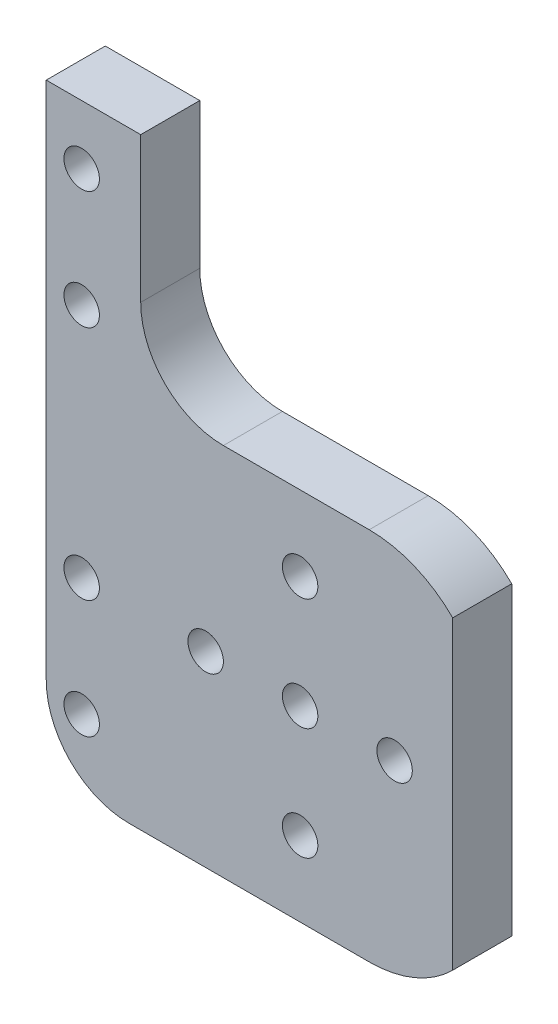
ISO-10303-21;
HEADER;
FILE_DESCRIPTION(('STEP AP214'),'2;1');
FILE_NAME('part.step','',(''),(''),'','','');
FILE_SCHEMA(('AUTOMOTIVE_DESIGN { 1 0 10303 214 1 1 1 1 }'));
ENDSEC;
DATA;
#1=APPLICATION_CONTEXT('core data for automotive mechanical design processes');
#2=APPLICATION_PROTOCOL_DEFINITION('international standard','automotive_design',2000,#1);
#3=PRODUCT_CONTEXT('',#1,'mechanical');
#4=PRODUCT('Part','Part','',(#3));
#5=PRODUCT_RELATED_PRODUCT_CATEGORY('part','',(#4));
#6=PRODUCT_DEFINITION_FORMATION('','',#4);
#7=PRODUCT_DEFINITION_CONTEXT('part definition',#1,'design');
#8=PRODUCT_DEFINITION('design','',#6,#7);
#9=PRODUCT_DEFINITION_SHAPE('','',#8);
#10=(LENGTH_UNIT() NAMED_UNIT(*) SI_UNIT(.MILLI.,.METRE.));
#11=(NAMED_UNIT(*) PLANE_ANGLE_UNIT() SI_UNIT($,.RADIAN.));
#12=(NAMED_UNIT(*) SI_UNIT($,.STERADIAN.) SOLID_ANGLE_UNIT());
#13=UNCERTAINTY_MEASURE_WITH_UNIT(LENGTH_MEASURE(1.E-05),#10,'distance_accuracy_value','');
#14=(GEOMETRIC_REPRESENTATION_CONTEXT(3) GLOBAL_UNCERTAINTY_ASSIGNED_CONTEXT((#13)) GLOBAL_UNIT_ASSIGNED_CONTEXT((#10,
#11,#12)) REPRESENTATION_CONTEXT('',''));
#15=CARTESIAN_POINT('',(0.,0.,0.));
#16=DIRECTION('',(0.,0.,1.));
#17=DIRECTION('',(1.,0.,0.));
#18=AXIS2_PLACEMENT_3D('',#15,#16,#17);
#19=CARTESIAN_POINT('',(-21.790532902454,-3.77314356435643,5.));
#20=DIRECTION('',(0.,0.,-1.));
#21=DIRECTION('',(-1.,0.,0.));
#22=AXIS2_PLACEMENT_3D('',#19,#20,#21);
#23=CYLINDRICAL_SURFACE('',#22,7.);
#24=CARTESIAN_POINT('',(-21.790532902454,-3.77314356435643,0.));
#25=DIRECTION('',(0.,0.,1.));
#26=DIRECTION('',(1.,0.,0.));
#27=AXIS2_PLACEMENT_3D('',#24,#25,#26);
#28=CIRCLE('',#27,7.);
#29=CARTESIAN_POINT('',(-21.790532902454,-10.7731435643564,0.));
#30=VERTEX_POINT('',#29);
#31=CARTESIAN_POINT('',(-28.790532902454,-3.77314356435636,0.));
#32=VERTEX_POINT('',#31);
#33=EDGE_CURVE('E190',#30,#32,#28,.F.);
#34=ORIENTED_EDGE('',*,*,#33,.F.);
#35=DIRECTION('',(0.,0.,-1.));
#36=VECTOR('',#35,1.);
#37=CARTESIAN_POINT('',(-21.790532902454,-10.7731435643564,5.));
#38=LINE('',#37,#36);
#39=CARTESIAN_POINT('',(-21.790532902454,-10.7731435643564,5.));
#40=VERTEX_POINT('',#39);
#41=EDGE_CURVE('E11',#40,#30,#38,.T.);
#42=ORIENTED_EDGE('',*,*,#41,.F.);
#43=CARTESIAN_POINT('',(-21.790532902454,-3.77314356435643,5.));
#44=DIRECTION('',(0.,0.,1.));
#45=DIRECTION('',(1.,0.,0.));
#46=AXIS2_PLACEMENT_3D('',#43,#44,#45);
#47=CIRCLE('',#46,7.);
#48=CARTESIAN_POINT('',(-28.790532902454,-3.77314356435636,5.));
#49=VERTEX_POINT('',#48);
#50=EDGE_CURVE('E512',#40,#49,#47,.F.);
#51=ORIENTED_EDGE('',*,*,#50,.T.);
#52=DIRECTION('',(0.,0.,-1.));
#53=VECTOR('',#52,1.);
#54=CARTESIAN_POINT('',(-28.790532902454,-3.77314356435636,5.));
#55=LINE('',#54,#53);
#56=EDGE_CURVE('E59',#49,#32,#55,.T.);
#57=ORIENTED_EDGE('',*,*,#56,.T.);
#58=EDGE_LOOP('',(#34,#42,#51,#57));
#59=FACE_BOUND('',#58,.T.);
#60=ADVANCED_FACE('F41',(#59),#23,.T.);
#61=CARTESIAN_POINT('',(0.,-10.7731435643564,5.));
#62=DIRECTION('',(0.,1.,0.));
#63=DIRECTION('',(0.,0.,1.));
#64=AXIS2_PLACEMENT_3D('',#61,#62,#63);
#65=PLANE('',#64);
#66=DIRECTION('',(1.,0.,0.));
#67=VECTOR('',#66,1.);
#68=CARTESIAN_POINT('',(0.,-10.7731435643564,0.));
#69=LINE('',#68,#67);
#70=CARTESIAN_POINT('',(-1.44053290245401,-10.7731435643564,0.));
#71=VERTEX_POINT('',#70);
#72=EDGE_CURVE('E193',#30,#71,#69,.T.);
#73=ORIENTED_EDGE('',*,*,#72,.T.);
#74=DIRECTION('',(0.,0.,-1.));
#75=VECTOR('',#74,1.);
#76=CARTESIAN_POINT('',(-1.44053290245401,-10.7731435643564,5.));
#77=LINE('',#76,#75);
#78=CARTESIAN_POINT('',(-1.44053290245401,-10.7731435643564,5.));
#79=VERTEX_POINT('',#78);
#80=EDGE_CURVE('E51',#79,#71,#77,.T.);
#81=ORIENTED_EDGE('',*,*,#80,.F.);
#82=DIRECTION('',(1.,0.,0.));
#83=VECTOR('',#82,1.);
#84=CARTESIAN_POINT('',(0.,-10.7731435643564,5.));
#85=LINE('',#84,#83);
#86=EDGE_CURVE('E503',#40,#79,#85,.T.);
#87=ORIENTED_EDGE('',*,*,#86,.F.);
#88=ORIENTED_EDGE('',*,*,#41,.T.);
#89=EDGE_LOOP('',(#73,#81,#87,#88));
#90=FACE_BOUND('',#89,.T.);
#91=ADVANCED_FACE('F262',(#90),#65,.F.);
#92=CARTESIAN_POINT('',(-1.44053290245394,-0.77314356435643,5.));
#93=DIRECTION('',(0.,0.,-1.));
#94=DIRECTION('',(-1.,0.,0.));
#95=AXIS2_PLACEMENT_3D('',#92,#93,#94);
#96=CYLINDRICAL_SURFACE('',#95,10.);
#97=CARTESIAN_POINT('',(-1.44053290245394,-0.77314356435643,0.));
#98=DIRECTION('',(0.,0.,1.));
#99=DIRECTION('',(1.,0.,0.));
#100=AXIS2_PLACEMENT_3D('',#97,#98,#99);
#101=CIRCLE('',#100,10.);
#102=CARTESIAN_POINT('',(5.63053490941151,-7.84421137622193,0.));
#103=VERTEX_POINT('',#102);
#104=EDGE_CURVE('E197',#71,#103,#101,.T.);
#105=ORIENTED_EDGE('',*,*,#104,.T.);
#106=DIRECTION('',(0.,0.,-1.));
#107=VECTOR('',#106,1.);
#108=CARTESIAN_POINT('',(5.63053490941151,-7.84421137622193,5.));
#109=LINE('',#108,#107);
#110=CARTESIAN_POINT('',(5.63053490941151,-7.84421137622193,5.));
#111=VERTEX_POINT('',#110);
#112=EDGE_CURVE('E250',#111,#103,#109,.T.);
#113=ORIENTED_EDGE('',*,*,#112,.F.);
#114=CARTESIAN_POINT('',(-1.44053290245394,-0.77314356435643,5.));
#115=DIRECTION('',(0.,0.,1.));
#116=DIRECTION('',(1.,0.,0.));
#117=AXIS2_PLACEMENT_3D('',#114,#115,#116);
#118=CIRCLE('',#117,10.);
#119=EDGE_CURVE('E258',#79,#111,#118,.T.);
#120=ORIENTED_EDGE('',*,*,#119,.F.);
#121=ORIENTED_EDGE('',*,*,#80,.T.);
#122=EDGE_LOOP('',(#105,#113,#120,#121));
#123=FACE_BOUND('',#122,.T.);
#124=ADVANCED_FACE('F256',(#123),#96,.T.);
#125=CARTESIAN_POINT('',(5.63053490941159,0.,5.));
#126=DIRECTION('',(1.,0.,0.));
#127=DIRECTION('',(0.,1.,0.));
#128=AXIS2_PLACEMENT_3D('',#125,#126,#127);
#129=PLANE('',#128);
#130=DIRECTION('',(0.,-1.,0.));
#131=VECTOR('',#130,1.);
#132=CARTESIAN_POINT('',(5.63053490941159,0.,0.));
#133=LINE('',#132,#131);
#134=CARTESIAN_POINT('',(5.63053490941176,17.997924247512,0.));
#135=VERTEX_POINT('',#134);
#136=EDGE_CURVE('E201',#135,#103,#133,.T.);
#137=ORIENTED_EDGE('',*,*,#136,.F.);
#138=DIRECTION('',(0.,0.,-1.));
#139=VECTOR('',#138,1.);
#140=CARTESIAN_POINT('',(5.63053490941176,17.997924247512,5.));
#141=LINE('',#140,#139);
#142=CARTESIAN_POINT('',(5.63053490941176,17.997924247512,5.));
#143=VERTEX_POINT('',#142);
#144=EDGE_CURVE('E247',#143,#135,#141,.T.);
#145=ORIENTED_EDGE('',*,*,#144,.F.);
#146=DIRECTION('',(0.,-1.,0.));
#147=VECTOR('',#146,1.);
#148=CARTESIAN_POINT('',(5.63053490941159,0.,5.));
#149=LINE('',#148,#147);
#150=EDGE_CURVE('E498',#143,#111,#149,.T.);
#151=ORIENTED_EDGE('',*,*,#150,.T.);
#152=ORIENTED_EDGE('',*,*,#112,.T.);
#153=EDGE_LOOP('',(#137,#145,#151,#152));
#154=FACE_BOUND('',#153,.T.);
#155=ADVANCED_FACE('F356',(#154),#129,.T.);
#156=CARTESIAN_POINT('',(-1.44053290245393,10.9268564356468,5.));
#157=DIRECTION('',(0.,0.,-1.));
#158=DIRECTION('',(-1.,0.,0.));
#159=AXIS2_PLACEMENT_3D('',#156,#157,#158);
#160=CYLINDRICAL_SURFACE('',#159,10.);
#161=CARTESIAN_POINT('',(-1.44053290245393,10.9268564356468,0.));
#162=DIRECTION('',(0.,0.,1.));
#163=DIRECTION('',(1.,0.,0.));
#164=AXIS2_PLACEMENT_3D('',#161,#162,#163);
#165=CIRCLE('',#164,10.);
#166=CARTESIAN_POINT('',(-1.44053290245393,20.9268564356468,0.));
#167=VERTEX_POINT('',#166);
#168=EDGE_CURVE('E205',#135,#167,#165,.T.);
#169=ORIENTED_EDGE('',*,*,#168,.T.);
#170=DIRECTION('',(0.,0.,-1.));
#171=VECTOR('',#170,1.);
#172=CARTESIAN_POINT('',(-1.44053290245393,20.9268564356468,5.));
#173=LINE('',#172,#171);
#174=CARTESIAN_POINT('',(-1.44053290245393,20.9268564356468,5.));
#175=VERTEX_POINT('',#174);
#176=EDGE_CURVE('E244',#175,#167,#173,.T.);
#177=ORIENTED_EDGE('',*,*,#176,.F.);
#178=CARTESIAN_POINT('',(-1.44053290245393,10.9268564356468,5.));
#179=DIRECTION('',(0.,0.,1.));
#180=DIRECTION('',(1.,0.,0.));
#181=AXIS2_PLACEMENT_3D('',#178,#179,#180);
#182=CIRCLE('',#181,10.);
#183=EDGE_CURVE('E494',#143,#175,#182,.T.);
#184=ORIENTED_EDGE('',*,*,#183,.F.);
#185=ORIENTED_EDGE('',*,*,#144,.T.);
#186=EDGE_LOOP('',(#169,#177,#184,#185));
#187=FACE_BOUND('',#186,.T.);
#188=ADVANCED_FACE('F352',(#187),#160,.T.);
#189=CARTESIAN_POINT('',(2.41035574838785E-13,20.9268564356467,5.));
#190=DIRECTION('',(0.,1.,0.));
#191=DIRECTION('',(-1.,0.,0.));
#192=AXIS2_PLACEMENT_3D('',#189,#190,#191);
#193=PLANE('',#192);
#194=DIRECTION('',(1.,0.,0.));
#195=VECTOR('',#194,1.);
#196=CARTESIAN_POINT('',(2.41035574838785E-13,20.9268564356467,0.));
#197=LINE('',#196,#195);
#198=CARTESIAN_POINT('',(-13.7905329024566,20.9268564356469,0.));
#199=VERTEX_POINT('',#198);
#200=EDGE_CURVE('E209',#199,#167,#197,.T.);
#201=ORIENTED_EDGE('',*,*,#200,.F.);
#202=DIRECTION('',(0.,0.,-1.));
#203=VECTOR('',#202,1.);
#204=CARTESIAN_POINT('',(-13.7905329024566,20.9268564356469,5.));
#205=LINE('',#204,#203);
#206=CARTESIAN_POINT('',(-13.7905329024566,20.9268564356469,5.));
#207=VERTEX_POINT('',#206);
#208=EDGE_CURVE('E241',#207,#199,#205,.T.);
#209=ORIENTED_EDGE('',*,*,#208,.F.);
#210=DIRECTION('',(1.,0.,0.));
#211=VECTOR('',#210,1.);
#212=CARTESIAN_POINT('',(2.41035574838785E-13,20.9268564356467,5.));
#213=LINE('',#212,#211);
#214=EDGE_CURVE('E497',#207,#175,#213,.T.);
#215=ORIENTED_EDGE('',*,*,#214,.T.);
#216=ORIENTED_EDGE('',*,*,#176,.T.);
#217=EDGE_LOOP('',(#201,#209,#215,#216));
#218=FACE_BOUND('',#217,.T.);
#219=ADVANCED_FACE('F348',(#218),#193,.T.);
#220=CARTESIAN_POINT('',(-13.7905329024566,27.9268564356469,5.));
#221=DIRECTION('',(0.,0.,-1.));
#222=DIRECTION('',(-1.,0.,0.));
#223=AXIS2_PLACEMENT_3D('',#220,#221,#222);
#224=CYLINDRICAL_SURFACE('',#223,7.00000000000001);
#225=CARTESIAN_POINT('',(-13.7905329024566,27.9268564356469,0.));
#226=DIRECTION('',(0.,0.,1.));
#227=DIRECTION('',(1.,0.,0.));
#228=AXIS2_PLACEMENT_3D('',#225,#226,#227);
#229=CIRCLE('',#228,7.00000000000001);
#230=CARTESIAN_POINT('',(-20.7905329024567,27.9268564356469,0.));
#231=VERTEX_POINT('',#230);
#232=EDGE_CURVE('E213',#231,#199,#229,.T.);
#233=ORIENTED_EDGE('',*,*,#232,.F.);
#234=DIRECTION('',(0.,0.,-1.));
#235=VECTOR('',#234,1.);
#236=CARTESIAN_POINT('',(-20.7905329024567,27.9268564356469,5.));
#237=LINE('',#236,#235);
#238=CARTESIAN_POINT('',(-20.7905329024567,27.9268564356469,5.));
#239=VERTEX_POINT('',#238);
#240=EDGE_CURVE('E144',#239,#231,#237,.T.);
#241=ORIENTED_EDGE('',*,*,#240,.F.);
#242=CARTESIAN_POINT('',(-13.7905329024566,27.9268564356469,5.));
#243=DIRECTION('',(0.,0.,1.));
#244=DIRECTION('',(1.,0.,0.));
#245=AXIS2_PLACEMENT_3D('',#242,#243,#244);
#246=CIRCLE('',#245,7.00000000000001);
#247=EDGE_CURVE('E132',#239,#207,#246,.T.);
#248=ORIENTED_EDGE('',*,*,#247,.T.);
#249=ORIENTED_EDGE('',*,*,#208,.T.);
#250=EDGE_LOOP('',(#233,#241,#248,#249));
#251=FACE_BOUND('',#250,.T.);
#252=ADVANCED_FACE('F345',(#251),#224,.F.);
#253=CARTESIAN_POINT('',(-20.7905329024567,0.,5.));
#254=DIRECTION('',(-1.,0.,0.));
#255=DIRECTION('',(0.,0.,1.));
#256=AXIS2_PLACEMENT_3D('',#253,#254,#255);
#257=PLANE('',#256);
#258=DIRECTION('',(0.,1.,0.));
#259=VECTOR('',#258,1.);
#260=CARTESIAN_POINT('',(-20.7905329024567,0.,0.));
#261=LINE('',#260,#259);
#262=CARTESIAN_POINT('',(-20.7905329024567,40.2268564356436,0.));
#263=VERTEX_POINT('',#262);
#264=EDGE_CURVE('E140',#231,#263,#261,.T.);
#265=ORIENTED_EDGE('',*,*,#264,.T.);
#266=DIRECTION('',(0.,0.,-1.));
#267=VECTOR('',#266,1.);
#268=CARTESIAN_POINT('',(-20.7905329024567,40.2268564356436,5.));
#269=LINE('',#268,#267);
#270=CARTESIAN_POINT('',(-20.7905329024567,40.2268564356436,5.));
#271=VERTEX_POINT('',#270);
#272=EDGE_CURVE('E137',#271,#263,#269,.T.);
#273=ORIENTED_EDGE('',*,*,#272,.F.);
#274=DIRECTION('',(0.,1.,0.));
#275=VECTOR('',#274,1.);
#276=CARTESIAN_POINT('',(-20.7905329024567,0.,5.));
#277=LINE('',#276,#275);
#278=EDGE_CURVE('E122',#239,#271,#277,.T.);
#279=ORIENTED_EDGE('',*,*,#278,.F.);
#280=ORIENTED_EDGE('',*,*,#240,.T.);
#281=EDGE_LOOP('',(#265,#273,#279,#280));
#282=FACE_BOUND('',#281,.T.);
#283=ADVANCED_FACE('F138',(#282),#257,.F.);
#284=CARTESIAN_POINT('',(0.,40.2268564356436,5.));
#285=DIRECTION('',(0.,1.,0.));
#286=DIRECTION('',(0.,0.,1.));
#287=AXIS2_PLACEMENT_3D('',#284,#285,#286);
#288=PLANE('',#287);
#289=DIRECTION('',(1.,0.,0.));
#290=VECTOR('',#289,1.);
#291=CARTESIAN_POINT('',(0.,40.2268564356436,0.));
#292=LINE('',#291,#290);
#293=CARTESIAN_POINT('',(-28.790532902454,40.2268564356436,0.));
#294=VERTEX_POINT('',#293);
#295=EDGE_CURVE('E219',#294,#263,#292,.T.);
#296=ORIENTED_EDGE('',*,*,#295,.F.);
#297=DIRECTION('',(0.,0.,-1.));
#298=VECTOR('',#297,1.);
#299=CARTESIAN_POINT('',(-28.790532902454,40.2268564356436,5.));
#300=LINE('',#299,#298);
#301=CARTESIAN_POINT('',(-28.790532902454,40.2268564356436,5.));
#302=VERTEX_POINT('',#301);
#303=EDGE_CURVE('E90',#302,#294,#300,.T.);
#304=ORIENTED_EDGE('',*,*,#303,.F.);
#305=DIRECTION('',(1.,0.,0.));
#306=VECTOR('',#305,1.);
#307=CARTESIAN_POINT('',(0.,40.2268564356436,5.));
#308=LINE('',#307,#306);
#309=EDGE_CURVE('E129',#302,#271,#308,.T.);
#310=ORIENTED_EDGE('',*,*,#309,.T.);
#311=ORIENTED_EDGE('',*,*,#272,.T.);
#312=EDGE_LOOP('',(#296,#304,#310,#311));
#313=FACE_BOUND('',#312,.T.);
#314=ADVANCED_FACE('F146',(#313),#288,.T.);
#315=CARTESIAN_POINT('',(-25.7905329024542,25.2268564356436,5.));
#316=DIRECTION('',(0.,0.,-1.));
#317=DIRECTION('',(-1.,0.,0.));
#318=AXIS2_PLACEMENT_3D('',#315,#316,#317);
#319=CYLINDRICAL_SURFACE('',#318,1.5);
#320=CARTESIAN_POINT('',(-25.7905329024542,25.2268564356436,5.));
#321=DIRECTION('',(0.,0.,1.));
#322=DIRECTION('',(1.,0.,0.));
#323=AXIS2_PLACEMENT_3D('',#320,#321,#322);
#324=CIRCLE('',#323,1.5);
#325=CARTESIAN_POINT('',(-24.2905329024542,25.2268564356436,5.));
#326=VERTEX_POINT('',#325);
#327=EDGE_CURVE('E151',#326,#326,#324,.T.);
#328=ORIENTED_EDGE('',*,*,#327,.T.);
#329=EDGE_LOOP('',(#328));
#330=FACE_BOUND('',#329,.T.);
#331=CARTESIAN_POINT('',(-25.7905329024542,25.2268564356436,0.));
#332=DIRECTION('',(0.,0.,1.));
#333=DIRECTION('',(1.,0.,0.));
#334=AXIS2_PLACEMENT_3D('',#331,#332,#333);
#335=CIRCLE('',#334,1.5);
#336=CARTESIAN_POINT('',(-24.2905329024542,25.2268564356436,0.));
#337=VERTEX_POINT('',#336);
#338=EDGE_CURVE('E226',#337,#337,#335,.T.);
#339=ORIENTED_EDGE('',*,*,#338,.F.);
#340=EDGE_LOOP('',(#339));
#341=FACE_BOUND('',#340,.T.);
#342=ADVANCED_FACE('F335',(#330,#341),#319,.F.);
#343=CARTESIAN_POINT('',(-28.790532902454,0.,5.));
#344=DIRECTION('',(-1.,0.,0.));
#345=DIRECTION('',(0.,-1.,0.));
#346=AXIS2_PLACEMENT_3D('',#343,#344,#345);
#347=PLANE('',#346);
#348=DIRECTION('',(0.,1.,0.));
#349=VECTOR('',#348,1.);
#350=CARTESIAN_POINT('',(-28.790532902454,0.,0.));
#351=LINE('',#350,#349);
#352=EDGE_CURVE('E222',#32,#294,#351,.T.);
#353=ORIENTED_EDGE('',*,*,#352,.F.);
#354=ORIENTED_EDGE('',*,*,#56,.F.);
#355=DIRECTION('',(0.,1.,0.));
#356=VECTOR('',#355,1.);
#357=CARTESIAN_POINT('',(-28.790532902454,0.,5.));
#358=LINE('',#357,#356);
#359=EDGE_CURVE('E148',#49,#302,#358,.T.);
#360=ORIENTED_EDGE('',*,*,#359,.T.);
#361=ORIENTED_EDGE('',*,*,#303,.T.);
#362=EDGE_LOOP('',(#353,#354,#360,#361));
#363=FACE_BOUND('',#362,.T.);
#364=ADVANCED_FACE('F278',(#363),#347,.T.);
#365=CARTESIAN_POINT('',(-7.29053290245394,14.5768564356436,5.));
#366=DIRECTION('',(0.,0.,-1.));
#367=DIRECTION('',(-1.,0.,0.));
#368=AXIS2_PLACEMENT_3D('',#365,#366,#367);
#369=CYLINDRICAL_SURFACE('',#368,1.5);
#370=CARTESIAN_POINT('',(-7.29053290245394,14.5768564356436,5.));
#371=DIRECTION('',(0.,0.,1.));
#372=DIRECTION('',(1.,0.,0.));
#373=AXIS2_PLACEMENT_3D('',#370,#371,#372);
#374=CIRCLE('',#373,1.5);
#375=CARTESIAN_POINT('',(-5.79053290245394,14.5768564356436,5.));
#376=VERTEX_POINT('',#375);
#377=EDGE_CURVE('E515',#376,#376,#374,.T.);
#378=ORIENTED_EDGE('',*,*,#377,.T.);
#379=EDGE_LOOP('',(#378));
#380=FACE_BOUND('',#379,.T.);
#381=CARTESIAN_POINT('',(-7.29053290245394,14.5768564356436,0.));
#382=DIRECTION('',(0.,0.,1.));
#383=DIRECTION('',(1.,0.,0.));
#384=AXIS2_PLACEMENT_3D('',#381,#382,#383);
#385=CIRCLE('',#384,1.5);
#386=CARTESIAN_POINT('',(-5.79053290245394,14.5768564356436,0.));
#387=VERTEX_POINT('',#386);
#388=EDGE_CURVE('E186',#387,#387,#385,.T.);
#389=ORIENTED_EDGE('',*,*,#388,.F.);
#390=EDGE_LOOP('',(#389));
#391=FACE_BOUND('',#390,.T.);
#392=ADVANCED_FACE('F274',(#380,#391),#369,.F.);
#393=CARTESIAN_POINT('',(0.709467097546067,5.07685643564355,5.));
#394=DIRECTION('',(0.,0.,-1.));
#395=DIRECTION('',(-1.,0.,0.));
#396=AXIS2_PLACEMENT_3D('',#393,#394,#395);
#397=CYLINDRICAL_SURFACE('',#396,1.5);
#398=CARTESIAN_POINT('',(0.709467097546067,5.07685643564355,5.));
#399=DIRECTION('',(0.,0.,1.));
#400=DIRECTION('',(1.,0.,0.));
#401=AXIS2_PLACEMENT_3D('',#398,#399,#400);
#402=CIRCLE('',#401,1.5);
#403=CARTESIAN_POINT('',(2.20946709754607,5.07685643564355,5.));
#404=VERTEX_POINT('',#403);
#405=EDGE_CURVE('E519',#404,#404,#402,.T.);
#406=ORIENTED_EDGE('',*,*,#405,.T.);
#407=EDGE_LOOP('',(#406));
#408=FACE_BOUND('',#407,.T.);
#409=CARTESIAN_POINT('',(0.709467097546067,5.07685643564355,0.));
#410=DIRECTION('',(0.,0.,1.));
#411=DIRECTION('',(1.,0.,0.));
#412=AXIS2_PLACEMENT_3D('',#409,#410,#411);
#413=CIRCLE('',#412,1.5);
#414=CARTESIAN_POINT('',(2.20946709754607,5.07685643564355,0.));
#415=VERTEX_POINT('',#414);
#416=EDGE_CURVE('E182',#415,#415,#413,.T.);
#417=ORIENTED_EDGE('',*,*,#416,.F.);
#418=EDGE_LOOP('',(#417));
#419=FACE_BOUND('',#418,.T.);
#420=ADVANCED_FACE('F277',(#408,#419),#397,.F.);
#421=CARTESIAN_POINT('',(-7.29053290245394,-4.42314356435645,5.));
#422=DIRECTION('',(0.,0.,-1.));
#423=DIRECTION('',(-1.,0.,0.));
#424=AXIS2_PLACEMENT_3D('',#421,#422,#423);
#425=CYLINDRICAL_SURFACE('',#424,1.5);
#426=CARTESIAN_POINT('',(-7.29053290245394,-4.42314356435645,5.));
#427=DIRECTION('',(0.,0.,1.));
#428=DIRECTION('',(1.,0.,0.));
#429=AXIS2_PLACEMENT_3D('',#426,#427,#428);
#430=CIRCLE('',#429,1.5);
#431=CARTESIAN_POINT('',(-5.79053290245394,-4.42314356435645,5.));
#432=VERTEX_POINT('',#431);
#433=EDGE_CURVE('E523',#432,#432,#430,.T.);
#434=ORIENTED_EDGE('',*,*,#433,.T.);
#435=EDGE_LOOP('',(#434));
#436=FACE_BOUND('',#435,.T.);
#437=CARTESIAN_POINT('',(-7.29053290245394,-4.42314356435645,0.));
#438=DIRECTION('',(0.,0.,1.));
#439=DIRECTION('',(1.,0.,0.));
#440=AXIS2_PLACEMENT_3D('',#437,#438,#439);
#441=CIRCLE('',#440,1.5);
#442=CARTESIAN_POINT('',(-5.79053290245394,-4.42314356435645,0.));
#443=VERTEX_POINT('',#442);
#444=EDGE_CURVE('E178',#443,#443,#441,.T.);
#445=ORIENTED_EDGE('',*,*,#444,.F.);
#446=EDGE_LOOP('',(#445));
#447=FACE_BOUND('',#446,.T.);
#448=ADVANCED_FACE('F282',(#436,#447),#425,.F.);
#449=CARTESIAN_POINT('',(-15.290532902454,5.07685643564355,5.));
#450=DIRECTION('',(0.,0.,-1.));
#451=DIRECTION('',(-1.,0.,0.));
#452=AXIS2_PLACEMENT_3D('',#449,#450,#451);
#453=CYLINDRICAL_SURFACE('',#452,1.5);
#454=CARTESIAN_POINT('',(-15.290532902454,5.07685643564355,5.));
#455=DIRECTION('',(0.,0.,1.));
#456=DIRECTION('',(1.,0.,0.));
#457=AXIS2_PLACEMENT_3D('',#454,#455,#456);
#458=CIRCLE('',#457,1.5);
#459=CARTESIAN_POINT('',(-13.790532902454,5.07685643564355,5.));
#460=VERTEX_POINT('',#459);
#461=EDGE_CURVE('E527',#460,#460,#458,.T.);
#462=ORIENTED_EDGE('',*,*,#461,.T.);
#463=EDGE_LOOP('',(#462));
#464=FACE_BOUND('',#463,.T.);
#465=CARTESIAN_POINT('',(-15.290532902454,5.07685643564355,0.));
#466=DIRECTION('',(0.,0.,1.));
#467=DIRECTION('',(1.,0.,0.));
#468=AXIS2_PLACEMENT_3D('',#465,#466,#467);
#469=CIRCLE('',#468,1.5);
#470=CARTESIAN_POINT('',(-13.790532902454,5.07685643564355,0.));
#471=VERTEX_POINT('',#470);
#472=EDGE_CURVE('E174',#471,#471,#469,.T.);
#473=ORIENTED_EDGE('',*,*,#472,.F.);
#474=EDGE_LOOP('',(#473));
#475=FACE_BOUND('',#474,.T.);
#476=ADVANCED_FACE('F286',(#464,#475),#453,.F.);
#477=CARTESIAN_POINT('',(-7.29053290245394,5.07685643564355,5.));
#478=DIRECTION('',(0.,0.,-1.));
#479=DIRECTION('',(-1.,0.,0.));
#480=AXIS2_PLACEMENT_3D('',#477,#478,#479);
#481=CYLINDRICAL_SURFACE('',#480,1.5);
#482=CARTESIAN_POINT('',(-7.29053290245394,5.07685643564355,5.));
#483=DIRECTION('',(0.,0.,1.));
#484=DIRECTION('',(1.,0.,0.));
#485=AXIS2_PLACEMENT_3D('',#482,#483,#484);
#486=CIRCLE('',#485,1.5);
#487=CARTESIAN_POINT('',(-5.79053290245394,5.07685643564355,5.));
#488=VERTEX_POINT('',#487);
#489=EDGE_CURVE('E531',#488,#488,#486,.T.);
#490=ORIENTED_EDGE('',*,*,#489,.T.);
#491=EDGE_LOOP('',(#490));
#492=FACE_BOUND('',#491,.T.);
#493=CARTESIAN_POINT('',(-7.29053290245394,5.07685643564355,0.));
#494=DIRECTION('',(0.,0.,1.));
#495=DIRECTION('',(1.,0.,0.));
#496=AXIS2_PLACEMENT_3D('',#493,#494,#495);
#497=CIRCLE('',#496,1.5);
#498=CARTESIAN_POINT('',(-5.79053290245394,5.07685643564355,0.));
#499=VERTEX_POINT('',#498);
#500=EDGE_CURVE('E170',#499,#499,#497,.T.);
#501=ORIENTED_EDGE('',*,*,#500,.F.);
#502=EDGE_LOOP('',(#501));
#503=FACE_BOUND('',#502,.T.);
#504=ADVANCED_FACE('F290',(#492,#503),#481,.F.);
#505=CARTESIAN_POINT('',(-25.790532902454,-4.77314356435639,5.));
#506=DIRECTION('',(0.,0.,-1.));
#507=DIRECTION('',(-1.,0.,0.));
#508=AXIS2_PLACEMENT_3D('',#505,#506,#507);
#509=CYLINDRICAL_SURFACE('',#508,1.50000000000002);
#510=CARTESIAN_POINT('',(-25.790532902454,-4.77314356435639,5.));
#511=DIRECTION('',(0.,0.,1.));
#512=DIRECTION('',(1.,0.,0.));
#513=AXIS2_PLACEMENT_3D('',#510,#511,#512);
#514=CIRCLE('',#513,1.50000000000002);
#515=CARTESIAN_POINT('',(-24.2905329024539,-4.77314356435639,5.));
#516=VERTEX_POINT('',#515);
#517=EDGE_CURVE('E305',#516,#516,#514,.T.);
#518=ORIENTED_EDGE('',*,*,#517,.T.);
#519=EDGE_LOOP('',(#518));
#520=FACE_BOUND('',#519,.T.);
#521=CARTESIAN_POINT('',(-25.790532902454,-4.77314356435639,0.));
#522=DIRECTION('',(0.,0.,1.));
#523=DIRECTION('',(1.,0.,0.));
#524=AXIS2_PLACEMENT_3D('',#521,#522,#523);
#525=CIRCLE('',#524,1.50000000000002);
#526=CARTESIAN_POINT('',(-24.2905329024539,-4.77314356435639,0.));
#527=VERTEX_POINT('',#526);
#528=EDGE_CURVE('E166',#527,#527,#525,.T.);
#529=ORIENTED_EDGE('',*,*,#528,.F.);
#530=EDGE_LOOP('',(#529));
#531=FACE_BOUND('',#530,.T.);
#532=ADVANCED_FACE('F293',(#520,#531),#509,.F.);
#533=CARTESIAN_POINT('',(-25.790532902454,5.22685643564358,5.));
#534=DIRECTION('',(0.,0.,-1.));
#535=DIRECTION('',(-1.,0.,0.));
#536=AXIS2_PLACEMENT_3D('',#533,#534,#535);
#537=CYLINDRICAL_SURFACE('',#536,1.49999999999998);
#538=CARTESIAN_POINT('',(-25.790532902454,5.22685643564358,5.));
#539=DIRECTION('',(0.,0.,1.));
#540=DIRECTION('',(1.,0.,0.));
#541=AXIS2_PLACEMENT_3D('',#538,#539,#540);
#542=CIRCLE('',#541,1.49999999999998);
#543=CARTESIAN_POINT('',(-24.2905329024541,5.22685643564358,5.));
#544=VERTEX_POINT('',#543);
#545=EDGE_CURVE('E234',#544,#544,#542,.T.);
#546=ORIENTED_EDGE('',*,*,#545,.T.);
#547=EDGE_LOOP('',(#546));
#548=FACE_BOUND('',#547,.T.);
#549=CARTESIAN_POINT('',(-25.790532902454,5.22685643564358,0.));
#550=DIRECTION('',(0.,0.,1.));
#551=DIRECTION('',(1.,0.,0.));
#552=AXIS2_PLACEMENT_3D('',#549,#550,#551);
#553=CIRCLE('',#552,1.49999999999998);
#554=CARTESIAN_POINT('',(-24.2905329024541,5.22685643564358,0.));
#555=VERTEX_POINT('',#554);
#556=EDGE_CURVE('E162',#555,#555,#553,.T.);
#557=ORIENTED_EDGE('',*,*,#556,.F.);
#558=EDGE_LOOP('',(#557));
#559=FACE_BOUND('',#558,.T.);
#560=ADVANCED_FACE('F43',(#548,#559),#537,.F.);
#561=CARTESIAN_POINT('',(-25.7905329024543,35.2268564356436,5.));
#562=DIRECTION('',(0.,0.,-1.));
#563=DIRECTION('',(-1.,0.,0.));
#564=AXIS2_PLACEMENT_3D('',#561,#562,#563);
#565=CYLINDRICAL_SURFACE('',#564,1.5);
#566=CARTESIAN_POINT('',(-25.7905329024543,35.2268564356436,5.));
#567=DIRECTION('',(0.,0.,1.));
#568=DIRECTION('',(1.,0.,0.));
#569=AXIS2_PLACEMENT_3D('',#566,#567,#568);
#570=CIRCLE('',#569,1.5);
#571=CARTESIAN_POINT('',(-24.2905329024543,35.2268564356436,5.));
#572=VERTEX_POINT('',#571);
#573=EDGE_CURVE('E158',#572,#572,#570,.F.);
#574=ORIENTED_EDGE('',*,*,#573,.F.);
#575=EDGE_LOOP('',(#574));
#576=FACE_BOUND('',#575,.T.);
#577=CARTESIAN_POINT('',(-25.7905329024543,35.2268564356436,0.));
#578=DIRECTION('',(0.,0.,1.));
#579=DIRECTION('',(1.,0.,0.));
#580=AXIS2_PLACEMENT_3D('',#577,#578,#579);
#581=CIRCLE('',#580,1.5);
#582=CARTESIAN_POINT('',(-24.2905329024543,35.2268564356436,0.));
#583=VERTEX_POINT('',#582);
#584=EDGE_CURVE('E230',#583,#583,#581,.F.);
#585=ORIENTED_EDGE('',*,*,#584,.T.);
#586=EDGE_LOOP('',(#585));
#587=FACE_BOUND('',#586,.T.);
#588=ADVANCED_FACE('F300',(#576,#587),#565,.F.);
#589=CARTESIAN_POINT('',(0.,0.,5.));
#590=DIRECTION('',(0.,0.,1.));
#591=DIRECTION('',(1.,0.,0.));
#592=AXIS2_PLACEMENT_3D('',#589,#590,#591);
#593=PLANE('',#592);
#594=ORIENTED_EDGE('',*,*,#545,.F.);
#595=EDGE_LOOP('',(#594));
#596=FACE_BOUND('',#595,.T.);
#597=ORIENTED_EDGE('',*,*,#517,.F.);
#598=EDGE_LOOP('',(#597));
#599=FACE_BOUND('',#598,.T.);
#600=ORIENTED_EDGE('',*,*,#489,.F.);
#601=EDGE_LOOP('',(#600));
#602=FACE_BOUND('',#601,.T.);
#603=ORIENTED_EDGE('',*,*,#461,.F.);
#604=EDGE_LOOP('',(#603));
#605=FACE_BOUND('',#604,.T.);
#606=ORIENTED_EDGE('',*,*,#433,.F.);
#607=EDGE_LOOP('',(#606));
#608=FACE_BOUND('',#607,.T.);
#609=ORIENTED_EDGE('',*,*,#405,.F.);
#610=EDGE_LOOP('',(#609));
#611=FACE_BOUND('',#610,.T.);
#612=ORIENTED_EDGE('',*,*,#377,.F.);
#613=EDGE_LOOP('',(#612));
#614=FACE_BOUND('',#613,.T.);
#615=ORIENTED_EDGE('',*,*,#50,.F.);
#616=ORIENTED_EDGE('',*,*,#86,.T.);
#617=ORIENTED_EDGE('',*,*,#119,.T.);
#618=ORIENTED_EDGE('',*,*,#150,.F.);
#619=ORIENTED_EDGE('',*,*,#183,.T.);
#620=ORIENTED_EDGE('',*,*,#214,.F.);
#621=ORIENTED_EDGE('',*,*,#247,.F.);
#622=ORIENTED_EDGE('',*,*,#278,.T.);
#623=ORIENTED_EDGE('',*,*,#309,.F.);
#624=ORIENTED_EDGE('',*,*,#359,.F.);
#625=EDGE_LOOP('',(#615,#616,#617,#618,#619,#620,#621,#622,#623,#624));
#626=FACE_BOUND('',#625,.T.);
#627=ORIENTED_EDGE('',*,*,#327,.F.);
#628=EDGE_LOOP('',(#627));
#629=FACE_BOUND('',#628,.T.);
#630=ORIENTED_EDGE('',*,*,#573,.T.);
#631=EDGE_LOOP('',(#630));
#632=FACE_BOUND('',#631,.T.);
#633=ADVANCED_FACE('F125',(#596,#599,#602,#605,#608,#611,#614,#626,#629,#632),#593,.T.);
#634=CARTESIAN_POINT('',(0.,0.,0.));
#635=DIRECTION('',(0.,0.,1.));
#636=DIRECTION('',(1.,0.,0.));
#637=AXIS2_PLACEMENT_3D('',#634,#635,#636);
#638=PLANE('',#637);
#639=ORIENTED_EDGE('',*,*,#556,.T.);
#640=EDGE_LOOP('',(#639));
#641=FACE_BOUND('',#640,.T.);
#642=ORIENTED_EDGE('',*,*,#528,.T.);
#643=EDGE_LOOP('',(#642));
#644=FACE_BOUND('',#643,.T.);
#645=ORIENTED_EDGE('',*,*,#500,.T.);
#646=EDGE_LOOP('',(#645));
#647=FACE_BOUND('',#646,.T.);
#648=ORIENTED_EDGE('',*,*,#472,.T.);
#649=EDGE_LOOP('',(#648));
#650=FACE_BOUND('',#649,.T.);
#651=ORIENTED_EDGE('',*,*,#444,.T.);
#652=EDGE_LOOP('',(#651));
#653=FACE_BOUND('',#652,.T.);
#654=ORIENTED_EDGE('',*,*,#416,.T.);
#655=EDGE_LOOP('',(#654));
#656=FACE_BOUND('',#655,.T.);
#657=ORIENTED_EDGE('',*,*,#388,.T.);
#658=EDGE_LOOP('',(#657));
#659=FACE_BOUND('',#658,.T.);
#660=ORIENTED_EDGE('',*,*,#33,.T.);
#661=ORIENTED_EDGE('',*,*,#352,.T.);
#662=ORIENTED_EDGE('',*,*,#295,.T.);
#663=ORIENTED_EDGE('',*,*,#264,.F.);
#664=ORIENTED_EDGE('',*,*,#232,.T.);
#665=ORIENTED_EDGE('',*,*,#200,.T.);
#666=ORIENTED_EDGE('',*,*,#168,.F.);
#667=ORIENTED_EDGE('',*,*,#136,.T.);
#668=ORIENTED_EDGE('',*,*,#104,.F.);
#669=ORIENTED_EDGE('',*,*,#72,.F.);
#670=EDGE_LOOP('',(#660,#661,#662,#663,#664,#665,#666,#667,#668,#669));
#671=FACE_BOUND('',#670,.T.);
#672=ORIENTED_EDGE('',*,*,#338,.T.);
#673=EDGE_LOOP('',(#672));
#674=FACE_BOUND('',#673,.T.);
#675=ORIENTED_EDGE('',*,*,#584,.F.);
#676=EDGE_LOOP('',(#675));
#677=FACE_BOUND('',#676,.T.);
#678=ADVANCED_FACE('F264',(#641,#644,#647,#650,#653,#656,#659,#671,#674,#677),#638,.F.);
#679=CLOSED_SHELL('',(#60,#91,#124,#155,#188,#219,#252,#283,#314,#342,#364,#392,#420,#448,#476,
#504,#532,#560,#588,#633,#678));
#680=MANIFOLD_SOLID_BREP('B2',#679);
#681=ADVANCED_BREP_SHAPE_REPRESENTATION('',(#18,#680),#14);
#682=SHAPE_DEFINITION_REPRESENTATION(#9,#681);
ENDSEC;
END-ISO-10303-21;
